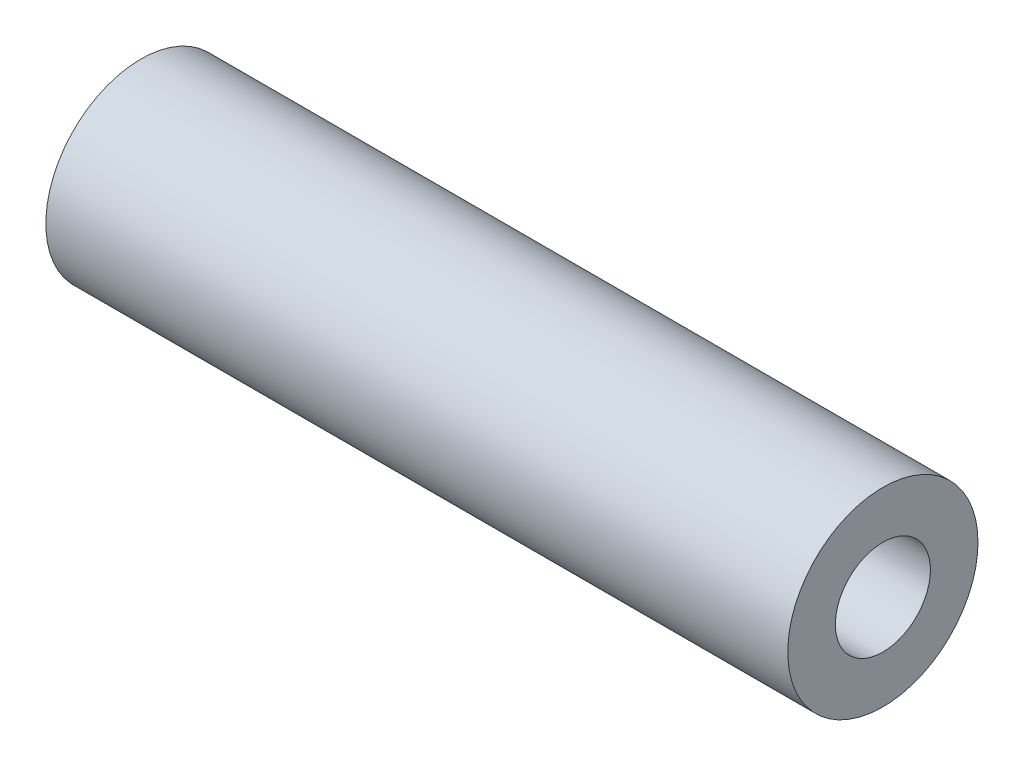
ISO-10303-21;
HEADER;
FILE_DESCRIPTION(('STEP AP214'),'2;1');
FILE_NAME('part.step','',(''),(''),'','','');
FILE_SCHEMA(('AUTOMOTIVE_DESIGN { 1 0 10303 214 1 1 1 1 }'));
ENDSEC;
DATA;
#1=APPLICATION_CONTEXT('core data for automotive mechanical design processes');
#2=APPLICATION_PROTOCOL_DEFINITION('international standard','automotive_design',2000,#1);
#3=PRODUCT_CONTEXT('',#1,'mechanical');
#4=PRODUCT('Part','Part','',(#3));
#5=PRODUCT_RELATED_PRODUCT_CATEGORY('part','',(#4));
#6=PRODUCT_DEFINITION_FORMATION('','',#4);
#7=PRODUCT_DEFINITION_CONTEXT('part definition',#1,'design');
#8=PRODUCT_DEFINITION('design','',#6,#7);
#9=PRODUCT_DEFINITION_SHAPE('','',#8);
#10=(LENGTH_UNIT() NAMED_UNIT(*) SI_UNIT(.MILLI.,.METRE.));
#11=(NAMED_UNIT(*) PLANE_ANGLE_UNIT() SI_UNIT($,.RADIAN.));
#12=(NAMED_UNIT(*) SI_UNIT($,.STERADIAN.) SOLID_ANGLE_UNIT());
#13=UNCERTAINTY_MEASURE_WITH_UNIT(LENGTH_MEASURE(1.E-05),#10,'distance_accuracy_value','');
#14=(GEOMETRIC_REPRESENTATION_CONTEXT(3) GLOBAL_UNCERTAINTY_ASSIGNED_CONTEXT((#13)) GLOBAL_UNIT_ASSIGNED_CONTEXT((#10,
#11,#12)) REPRESENTATION_CONTEXT('',''));
#15=CARTESIAN_POINT('',(0.,0.,0.));
#16=DIRECTION('',(0.,0.,1.));
#17=DIRECTION('',(1.,0.,0.));
#18=AXIS2_PLACEMENT_3D('',#15,#16,#17);
#19=CARTESIAN_POINT('',(19.5,0.,0.));
#20=DIRECTION('',(1.,0.,0.));
#21=DIRECTION('',(0.,0.,-1.));
#22=AXIS2_PLACEMENT_3D('',#19,#20,#21);
#23=PLANE('',#22);
#24=CARTESIAN_POINT('',(19.5,0.,0.));
#25=DIRECTION('',(1.,0.,0.));
#26=DIRECTION('',(0.,0.,-1.));
#27=AXIS2_PLACEMENT_3D('',#24,#25,#26);
#28=CIRCLE('',#27,5.);
#29=CARTESIAN_POINT('',(19.5,0.,-5.));
#30=VERTEX_POINT('',#29);
#31=EDGE_CURVE('E10',#30,#30,#28,.T.);
#32=ORIENTED_EDGE('',*,*,#31,.T.);
#33=EDGE_LOOP('',(#32));
#34=FACE_BOUND('',#33,.T.);
#35=CARTESIAN_POINT('',(19.5,0.,0.));
#36=DIRECTION('',(1.,0.,0.));
#37=DIRECTION('',(0.,0.,-1.));
#38=AXIS2_PLACEMENT_3D('',#35,#36,#37);
#39=CIRCLE('',#38,2.5);
#40=CARTESIAN_POINT('',(19.5,0.,-2.5));
#41=VERTEX_POINT('',#40);
#42=EDGE_CURVE('E50',#41,#41,#39,.T.);
#43=ORIENTED_EDGE('',*,*,#42,.F.);
#44=EDGE_LOOP('',(#43));
#45=FACE_BOUND('',#44,.T.);
#46=ADVANCED_FACE('F39',(#34,#45),#23,.T.);
#47=CARTESIAN_POINT('',(-19.5,0.,0.));
#48=DIRECTION('',(1.,0.,0.));
#49=DIRECTION('',(0.,0.,-1.));
#50=AXIS2_PLACEMENT_3D('',#47,#48,#49);
#51=PLANE('',#50);
#52=CARTESIAN_POINT('',(-19.5,0.,0.));
#53=DIRECTION('',(1.,0.,0.));
#54=DIRECTION('',(0.,0.,-1.));
#55=AXIS2_PLACEMENT_3D('',#52,#53,#54);
#56=CIRCLE('',#55,5.);
#57=CARTESIAN_POINT('',(-19.5,0.,-5.));
#58=VERTEX_POINT('',#57);
#59=EDGE_CURVE('E43',#58,#58,#56,.T.);
#60=ORIENTED_EDGE('',*,*,#59,.F.);
#61=EDGE_LOOP('',(#60));
#62=FACE_BOUND('',#61,.T.);
#63=CARTESIAN_POINT('',(-19.5,0.,0.));
#64=DIRECTION('',(1.,0.,0.));
#65=DIRECTION('',(0.,0.,-1.));
#66=AXIS2_PLACEMENT_3D('',#63,#64,#65);
#67=CIRCLE('',#66,2.5);
#68=CARTESIAN_POINT('',(-19.5,0.,-2.5));
#69=VERTEX_POINT('',#68);
#70=EDGE_CURVE('E52',#69,#69,#67,.T.);
#71=ORIENTED_EDGE('',*,*,#70,.T.);
#72=EDGE_LOOP('',(#71));
#73=FACE_BOUND('',#72,.T.);
#74=ADVANCED_FACE('F62',(#62,#73),#51,.F.);
#75=CARTESIAN_POINT('',(19.5,0.,0.));
#76=DIRECTION('',(-1.,0.,0.));
#77=DIRECTION('',(0.,0.,1.));
#78=AXIS2_PLACEMENT_3D('',#75,#76,#77);
#79=CYLINDRICAL_SURFACE('',#78,5.);
#80=ORIENTED_EDGE('',*,*,#31,.F.);
#81=EDGE_LOOP('',(#80));
#82=FACE_BOUND('',#81,.T.);
#83=ORIENTED_EDGE('',*,*,#59,.T.);
#84=EDGE_LOOP('',(#83));
#85=FACE_BOUND('',#84,.T.);
#86=ADVANCED_FACE('F41',(#82,#85),#79,.T.);
#87=CARTESIAN_POINT('',(19.5,0.,0.));
#88=DIRECTION('',(-1.,0.,0.));
#89=DIRECTION('',(0.,0.,1.));
#90=AXIS2_PLACEMENT_3D('',#87,#88,#89);
#91=CYLINDRICAL_SURFACE('',#90,2.5);
#92=ORIENTED_EDGE('',*,*,#42,.T.);
#93=EDGE_LOOP('',(#92));
#94=FACE_BOUND('',#93,.T.);
#95=ORIENTED_EDGE('',*,*,#70,.F.);
#96=EDGE_LOOP('',(#95));
#97=FACE_BOUND('',#96,.T.);
#98=ADVANCED_FACE('F58',(#94,#97),#91,.F.);
#99=CLOSED_SHELL('',(#46,#74,#86,#98));
#100=MANIFOLD_SOLID_BREP('B2',#99);
#101=ADVANCED_BREP_SHAPE_REPRESENTATION('',(#18,#100),#14);
#102=SHAPE_DEFINITION_REPRESENTATION(#9,#101);
ENDSEC;
END-ISO-10303-21;
